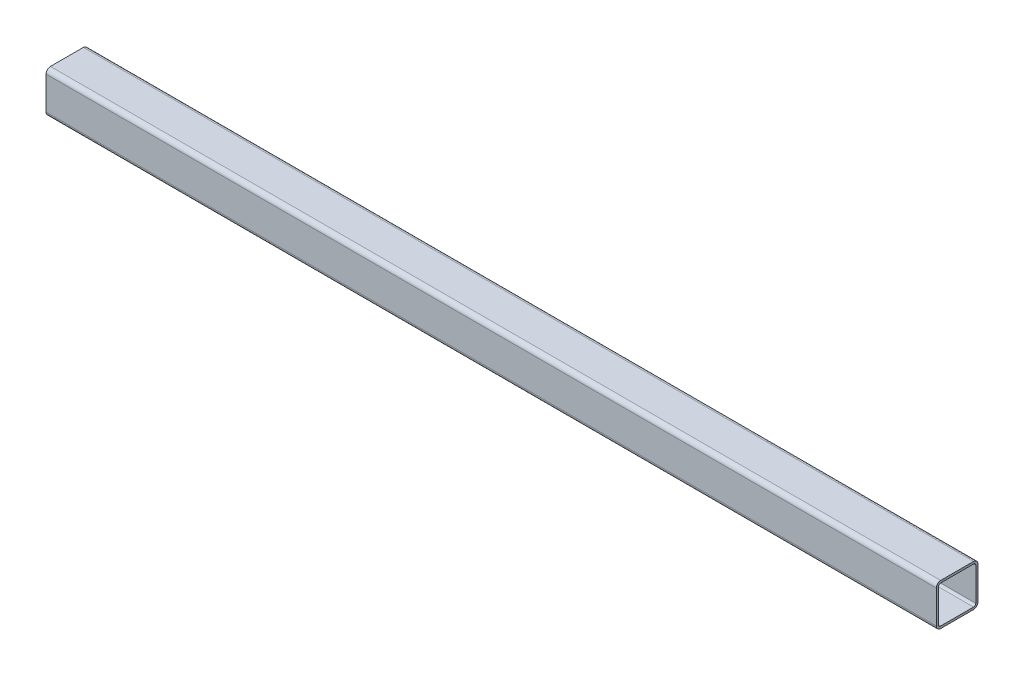
ISO-10303-21;
HEADER;
FILE_DESCRIPTION(('STEP AP214'),'2;1');
FILE_NAME('part.step','',(''),(''),'','','');
FILE_SCHEMA(('AUTOMOTIVE_DESIGN { 1 0 10303 214 1 1 1 1 }'));
ENDSEC;
DATA;
#1=APPLICATION_CONTEXT('core data for automotive mechanical design processes');
#2=APPLICATION_PROTOCOL_DEFINITION('international standard','automotive_design',2000,#1);
#3=PRODUCT_CONTEXT('',#1,'mechanical');
#4=PRODUCT('Part','Part','',(#3));
#5=PRODUCT_RELATED_PRODUCT_CATEGORY('part','',(#4));
#6=PRODUCT_DEFINITION_FORMATION('','',#4);
#7=PRODUCT_DEFINITION_CONTEXT('part definition',#1,'design');
#8=PRODUCT_DEFINITION('design','',#6,#7);
#9=PRODUCT_DEFINITION_SHAPE('','',#8);
#10=(LENGTH_UNIT() NAMED_UNIT(*) SI_UNIT(.MILLI.,.METRE.));
#11=(NAMED_UNIT(*) PLANE_ANGLE_UNIT() SI_UNIT($,.RADIAN.));
#12=(NAMED_UNIT(*) SI_UNIT($,.STERADIAN.) SOLID_ANGLE_UNIT());
#13=UNCERTAINTY_MEASURE_WITH_UNIT(LENGTH_MEASURE(1.E-05),#10,'distance_accuracy_value','');
#14=(GEOMETRIC_REPRESENTATION_CONTEXT(3) GLOBAL_UNCERTAINTY_ASSIGNED_CONTEXT((#13)) GLOBAL_UNIT_ASSIGNED_CONTEXT((#10,
#11,#12)) REPRESENTATION_CONTEXT('',''));
#15=CARTESIAN_POINT('',(0.,0.,0.));
#16=DIRECTION('',(0.,0.,1.));
#17=DIRECTION('',(1.,0.,0.));
#18=AXIS2_PLACEMENT_3D('',#15,#16,#17);
#19=CARTESIAN_POINT('',(530.,260.,1160.));
#20=DIRECTION('',(0.,-1.,0.));
#21=DIRECTION('',(0.,0.,-1.));
#22=AXIS2_PLACEMENT_3D('',#19,#20,#21);
#23=CYLINDRICAL_SURFACE('',#22,2.49999999999995);
#24=CARTESIAN_POINT('',(530.,270.,1160.));
#25=DIRECTION('',(0.,-1.,0.));
#26=DIRECTION('',(0.,0.,-1.));
#27=AXIS2_PLACEMENT_3D('',#24,#25,#26);
#28=CIRCLE('',#27,2.49999999999995);
#29=CARTESIAN_POINT('',(530.,270.,1157.5));
#30=VERTEX_POINT('',#29);
#31=EDGE_CURVE('E172',#30,#30,#28,.T.);
#32=ORIENTED_EDGE('',*,*,#31,.T.);
#33=EDGE_LOOP('',(#32));
#34=FACE_BOUND('',#33,.T.);
#35=CARTESIAN_POINT('',(530.,273.2,1160.));
#36=DIRECTION('',(0.,-1.,0.));
#37=DIRECTION('',(0.,0.,-1.));
#38=AXIS2_PLACEMENT_3D('',#35,#36,#37);
#39=CIRCLE('',#38,2.49999999999995);
#40=CARTESIAN_POINT('',(530.,273.2,1157.5));
#41=VERTEX_POINT('',#40);
#42=EDGE_CURVE('E20',#41,#41,#39,.T.);
#43=ORIENTED_EDGE('',*,*,#42,.F.);
#44=EDGE_LOOP('',(#43));
#45=FACE_BOUND('',#44,.T.);
#46=ADVANCED_FACE('F17',(#34,#45),#23,.F.);
#47=CARTESIAN_POINT('',(490.,260.,1160.));
#48=DIRECTION('',(0.,-1.,0.));
#49=DIRECTION('',(0.,0.,-1.));
#50=AXIS2_PLACEMENT_3D('',#47,#48,#49);
#51=CYLINDRICAL_SURFACE('',#50,2.49999999999995);
#52=CARTESIAN_POINT('',(490.,270.,1160.));
#53=DIRECTION('',(0.,-1.,0.));
#54=DIRECTION('',(0.,0.,-1.));
#55=AXIS2_PLACEMENT_3D('',#52,#53,#54);
#56=CIRCLE('',#55,2.49999999999995);
#57=CARTESIAN_POINT('',(490.,270.,1157.5));
#58=VERTEX_POINT('',#57);
#59=EDGE_CURVE('E243',#58,#58,#56,.T.);
#60=ORIENTED_EDGE('',*,*,#59,.T.);
#61=EDGE_LOOP('',(#60));
#62=FACE_BOUND('',#61,.T.);
#63=CARTESIAN_POINT('',(490.,273.2,1160.));
#64=DIRECTION('',(0.,-1.,0.));
#65=DIRECTION('',(0.,0.,-1.));
#66=AXIS2_PLACEMENT_3D('',#63,#64,#65);
#67=CIRCLE('',#66,2.49999999999995);
#68=CARTESIAN_POINT('',(490.,273.2,1157.5));
#69=VERTEX_POINT('',#68);
#70=EDGE_CURVE('E264',#69,#69,#67,.T.);
#71=ORIENTED_EDGE('',*,*,#70,.F.);
#72=EDGE_LOOP('',(#71));
#73=FACE_BOUND('',#72,.T.);
#74=ADVANCED_FACE('F273',(#62,#73),#51,.F.);
#75=CARTESIAN_POINT('',(490.,260.,1180.));
#76=DIRECTION('',(0.,-1.,0.));
#77=DIRECTION('',(0.,0.,-1.));
#78=AXIS2_PLACEMENT_3D('',#75,#76,#77);
#79=CYLINDRICAL_SURFACE('',#78,2.49999999999995);
#80=CARTESIAN_POINT('',(490.,270.,1180.));
#81=DIRECTION('',(0.,-1.,0.));
#82=DIRECTION('',(0.,0.,-1.));
#83=AXIS2_PLACEMENT_3D('',#80,#81,#82);
#84=CIRCLE('',#83,2.49999999999995);
#85=CARTESIAN_POINT('',(490.,270.,1177.5));
#86=VERTEX_POINT('',#85);
#87=EDGE_CURVE('E240',#86,#86,#84,.T.);
#88=ORIENTED_EDGE('',*,*,#87,.T.);
#89=EDGE_LOOP('',(#88));
#90=FACE_BOUND('',#89,.T.);
#91=CARTESIAN_POINT('',(490.,273.2,1180.));
#92=DIRECTION('',(0.,-1.,0.));
#93=DIRECTION('',(0.,0.,-1.));
#94=AXIS2_PLACEMENT_3D('',#91,#92,#93);
#95=CIRCLE('',#94,2.49999999999995);
#96=CARTESIAN_POINT('',(490.,273.2,1177.5));
#97=VERTEX_POINT('',#96);
#98=EDGE_CURVE('E262',#97,#97,#95,.T.);
#99=ORIENTED_EDGE('',*,*,#98,.F.);
#100=EDGE_LOOP('',(#99));
#101=FACE_BOUND('',#100,.T.);
#102=ADVANCED_FACE('F279',(#90,#101),#79,.F.);
#103=CARTESIAN_POINT('',(530.,260.,1180.));
#104=DIRECTION('',(0.,-1.,0.));
#105=DIRECTION('',(0.,0.,-1.));
#106=AXIS2_PLACEMENT_3D('',#103,#104,#105);
#107=CYLINDRICAL_SURFACE('',#106,2.49999999999995);
#108=CARTESIAN_POINT('',(530.,270.,1180.));
#109=DIRECTION('',(0.,-1.,0.));
#110=DIRECTION('',(0.,0.,-1.));
#111=AXIS2_PLACEMENT_3D('',#108,#109,#110);
#112=CIRCLE('',#111,2.49999999999995);
#113=CARTESIAN_POINT('',(530.,270.,1177.5));
#114=VERTEX_POINT('',#113);
#115=EDGE_CURVE('E237',#114,#114,#112,.T.);
#116=ORIENTED_EDGE('',*,*,#115,.T.);
#117=EDGE_LOOP('',(#116));
#118=FACE_BOUND('',#117,.T.);
#119=CARTESIAN_POINT('',(530.,273.2,1180.));
#120=DIRECTION('',(0.,-1.,0.));
#121=DIRECTION('',(0.,0.,-1.));
#122=AXIS2_PLACEMENT_3D('',#119,#120,#121);
#123=CIRCLE('',#122,2.49999999999995);
#124=CARTESIAN_POINT('',(530.,273.2,1177.5));
#125=VERTEX_POINT('',#124);
#126=EDGE_CURVE('E259',#125,#125,#123,.T.);
#127=ORIENTED_EDGE('',*,*,#126,.F.);
#128=EDGE_LOOP('',(#127));
#129=FACE_BOUND('',#128,.T.);
#130=ADVANCED_FACE('F365',(#118,#129),#107,.F.);
#131=CARTESIAN_POINT('',(-530.,260.,1180.));
#132=DIRECTION('',(0.,-1.,0.));
#133=DIRECTION('',(0.,0.,-1.));
#134=AXIS2_PLACEMENT_3D('',#131,#132,#133);
#135=CYLINDRICAL_SURFACE('',#134,2.49999999999995);
#136=CARTESIAN_POINT('',(-530.,270.,1180.));
#137=DIRECTION('',(0.,-1.,0.));
#138=DIRECTION('',(0.,0.,-1.));
#139=AXIS2_PLACEMENT_3D('',#136,#137,#138);
#140=CIRCLE('',#139,2.49999999999995);
#141=CARTESIAN_POINT('',(-530.,270.,1177.5));
#142=VERTEX_POINT('',#141);
#143=EDGE_CURVE('E234',#142,#142,#140,.T.);
#144=ORIENTED_EDGE('',*,*,#143,.T.);
#145=EDGE_LOOP('',(#144));
#146=FACE_BOUND('',#145,.T.);
#147=CARTESIAN_POINT('',(-530.,273.2,1180.));
#148=DIRECTION('',(0.,-1.,0.));
#149=DIRECTION('',(0.,0.,-1.));
#150=AXIS2_PLACEMENT_3D('',#147,#148,#149);
#151=CIRCLE('',#150,2.49999999999995);
#152=CARTESIAN_POINT('',(-530.,273.2,1177.5));
#153=VERTEX_POINT('',#152);
#154=EDGE_CURVE('E256',#153,#153,#151,.T.);
#155=ORIENTED_EDGE('',*,*,#154,.F.);
#156=EDGE_LOOP('',(#155));
#157=FACE_BOUND('',#156,.T.);
#158=ADVANCED_FACE('F361',(#146,#157),#135,.F.);
#159=CARTESIAN_POINT('',(-490.,260.,1180.));
#160=DIRECTION('',(0.,-1.,0.));
#161=DIRECTION('',(0.,0.,-1.));
#162=AXIS2_PLACEMENT_3D('',#159,#160,#161);
#163=CYLINDRICAL_SURFACE('',#162,2.49999999999995);
#164=CARTESIAN_POINT('',(-490.,270.,1180.));
#165=DIRECTION('',(0.,-1.,0.));
#166=DIRECTION('',(0.,0.,-1.));
#167=AXIS2_PLACEMENT_3D('',#164,#165,#166);
#168=CIRCLE('',#167,2.49999999999995);
#169=CARTESIAN_POINT('',(-490.,270.,1177.5));
#170=VERTEX_POINT('',#169);
#171=EDGE_CURVE('E231',#170,#170,#168,.T.);
#172=ORIENTED_EDGE('',*,*,#171,.T.);
#173=EDGE_LOOP('',(#172));
#174=FACE_BOUND('',#173,.T.);
#175=CARTESIAN_POINT('',(-490.,273.2,1180.));
#176=DIRECTION('',(0.,-1.,0.));
#177=DIRECTION('',(0.,0.,-1.));
#178=AXIS2_PLACEMENT_3D('',#175,#176,#177);
#179=CIRCLE('',#178,2.49999999999995);
#180=CARTESIAN_POINT('',(-490.,273.2,1177.5));
#181=VERTEX_POINT('',#180);
#182=EDGE_CURVE('E253',#181,#181,#179,.T.);
#183=ORIENTED_EDGE('',*,*,#182,.F.);
#184=EDGE_LOOP('',(#183));
#185=FACE_BOUND('',#184,.T.);
#186=ADVANCED_FACE('F357',(#174,#185),#163,.F.);
#187=CARTESIAN_POINT('',(-490.,260.,1160.));
#188=DIRECTION('',(0.,-1.,0.));
#189=DIRECTION('',(0.,0.,-1.));
#190=AXIS2_PLACEMENT_3D('',#187,#188,#189);
#191=CYLINDRICAL_SURFACE('',#190,2.49999999999995);
#192=CARTESIAN_POINT('',(-490.,270.,1160.));
#193=DIRECTION('',(0.,-1.,0.));
#194=DIRECTION('',(0.,0.,-1.));
#195=AXIS2_PLACEMENT_3D('',#192,#193,#194);
#196=CIRCLE('',#195,2.49999999999995);
#197=CARTESIAN_POINT('',(-490.,270.,1157.5));
#198=VERTEX_POINT('',#197);
#199=EDGE_CURVE('E228',#198,#198,#196,.T.);
#200=ORIENTED_EDGE('',*,*,#199,.T.);
#201=EDGE_LOOP('',(#200));
#202=FACE_BOUND('',#201,.T.);
#203=CARTESIAN_POINT('',(-490.,273.2,1160.));
#204=DIRECTION('',(0.,-1.,0.));
#205=DIRECTION('',(0.,0.,-1.));
#206=AXIS2_PLACEMENT_3D('',#203,#204,#205);
#207=CIRCLE('',#206,2.49999999999995);
#208=CARTESIAN_POINT('',(-490.,273.2,1157.5));
#209=VERTEX_POINT('',#208);
#210=EDGE_CURVE('E250',#209,#209,#207,.T.);
#211=ORIENTED_EDGE('',*,*,#210,.F.);
#212=EDGE_LOOP('',(#211));
#213=FACE_BOUND('',#212,.T.);
#214=ADVANCED_FACE('F353',(#202,#213),#191,.F.);
#215=CARTESIAN_POINT('',(-530.,260.,1160.));
#216=DIRECTION('',(0.,-1.,0.));
#217=DIRECTION('',(0.,0.,-1.));
#218=AXIS2_PLACEMENT_3D('',#215,#216,#217);
#219=CYLINDRICAL_SURFACE('',#218,2.49999999999995);
#220=CARTESIAN_POINT('',(-530.,270.,1160.));
#221=DIRECTION('',(0.,-1.,0.));
#222=DIRECTION('',(0.,0.,-1.));
#223=AXIS2_PLACEMENT_3D('',#220,#221,#222);
#224=CIRCLE('',#223,2.49999999999995);
#225=CARTESIAN_POINT('',(-530.,270.,1157.5));
#226=VERTEX_POINT('',#225);
#227=EDGE_CURVE('E159',#226,#226,#224,.T.);
#228=ORIENTED_EDGE('',*,*,#227,.T.);
#229=EDGE_LOOP('',(#228));
#230=FACE_BOUND('',#229,.T.);
#231=CARTESIAN_POINT('',(-530.,273.2,1160.));
#232=DIRECTION('',(0.,-1.,0.));
#233=DIRECTION('',(0.,0.,-1.));
#234=AXIS2_PLACEMENT_3D('',#231,#232,#233);
#235=CIRCLE('',#234,2.49999999999995);
#236=CARTESIAN_POINT('',(-530.,273.2,1157.5));
#237=VERTEX_POINT('',#236);
#238=EDGE_CURVE('E175',#237,#237,#235,.T.);
#239=ORIENTED_EDGE('',*,*,#238,.F.);
#240=EDGE_LOOP('',(#239));
#241=FACE_BOUND('',#240,.T.);
#242=ADVANCED_FACE('F349',(#230,#241),#219,.F.);
#243=CARTESIAN_POINT('',(670.,326.8,1146.4));
#244=DIRECTION('',(0.,-1.,0.));
#245=DIRECTION('',(0.,0.,-1.));
#246=AXIS2_PLACEMENT_3D('',#243,#244,#245);
#247=PLANE('',#246);
#248=DIRECTION('',(-1.,0.,0.));
#249=VECTOR('',#248,1.);
#250=CARTESIAN_POINT('',(670.,326.8,1193.6));
#251=LINE('',#250,#249);
#252=CARTESIAN_POINT('',(640.,326.8,1193.6));
#253=VERTEX_POINT('',#252);
#254=CARTESIAN_POINT('',(-640.,326.8,1193.6));
#255=VERTEX_POINT('',#254);
#256=EDGE_CURVE('E169',#253,#255,#251,.T.);
#257=ORIENTED_EDGE('',*,*,#256,.T.);
#258=DIRECTION('',(0.,0.,1.));
#259=VECTOR('',#258,1.);
#260=CARTESIAN_POINT('',(-640.,326.8,1170.));
#261=LINE('',#260,#259);
#262=CARTESIAN_POINT('',(-640.,326.8,1146.4));
#263=VERTEX_POINT('',#262);
#264=EDGE_CURVE('E222',#263,#255,#261,.T.);
#265=ORIENTED_EDGE('',*,*,#264,.F.);
#266=DIRECTION('',(-1.,0.,0.));
#267=VECTOR('',#266,1.);
#268=CARTESIAN_POINT('',(670.,326.8,1146.4));
#269=LINE('',#268,#267);
#270=CARTESIAN_POINT('',(640.,326.8,1146.4));
#271=VERTEX_POINT('',#270);
#272=EDGE_CURVE('E181',#263,#271,#269,.F.);
#273=ORIENTED_EDGE('',*,*,#272,.T.);
#274=DIRECTION('',(0.,0.,-1.));
#275=VECTOR('',#274,1.);
#276=CARTESIAN_POINT('',(640.,326.8,1170.));
#277=LINE('',#276,#275);
#278=EDGE_CURVE('E208',#253,#271,#277,.T.);
#279=ORIENTED_EDGE('',*,*,#278,.F.);
#280=EDGE_LOOP('',(#257,#265,#273,#279));
#281=FACE_BOUND('',#280,.T.);
#282=ADVANCED_FACE('F345',(#281),#247,.T.);
#283=CARTESIAN_POINT('',(670.,323.6,1146.4));
#284=DIRECTION('',(-1.,0.,0.));
#285=DIRECTION('',(0.,-1.,0.));
#286=AXIS2_PLACEMENT_3D('',#283,#284,#285);
#287=CYLINDRICAL_SURFACE('',#286,3.19999999999998);
#288=CARTESIAN_POINT('',(640.,323.6,1146.4));
#289=DIRECTION('',(-1.,0.,0.));
#290=DIRECTION('',(0.,-1.,0.));
#291=AXIS2_PLACEMENT_3D('',#288,#289,#290);
#292=CIRCLE('',#291,3.19999999999998);
#293=CARTESIAN_POINT('',(640.,323.6,1143.2));
#294=VERTEX_POINT('',#293);
#295=EDGE_CURVE('E206',#271,#294,#292,.T.);
#296=ORIENTED_EDGE('',*,*,#295,.F.);
#297=ORIENTED_EDGE('',*,*,#272,.F.);
#298=CARTESIAN_POINT('',(-640.,323.6,1146.4));
#299=DIRECTION('',(-1.,0.,0.));
#300=DIRECTION('',(0.,-1.,0.));
#301=AXIS2_PLACEMENT_3D('',#298,#299,#300);
#302=CIRCLE('',#301,3.19999999999998);
#303=CARTESIAN_POINT('',(-640.,323.6,1143.2));
#304=VERTEX_POINT('',#303);
#305=EDGE_CURVE('E223',#304,#263,#302,.F.);
#306=ORIENTED_EDGE('',*,*,#305,.F.);
#307=DIRECTION('',(1.,0.,0.));
#308=VECTOR('',#307,1.);
#309=CARTESIAN_POINT('',(670.,323.6,1143.2));
#310=LINE('',#309,#308);
#311=EDGE_CURVE('E179',#294,#304,#310,.F.);
#312=ORIENTED_EDGE('',*,*,#311,.F.);
#313=EDGE_LOOP('',(#296,#297,#306,#312));
#314=FACE_BOUND('',#313,.T.);
#315=ADVANCED_FACE('F341',(#314),#287,.F.);
#316=CARTESIAN_POINT('',(670.,323.6,1143.2));
#317=DIRECTION('',(0.,0.,1.));
#318=DIRECTION('',(0.,-1.,0.));
#319=AXIS2_PLACEMENT_3D('',#316,#317,#318);
#320=PLANE('',#319);
#321=ORIENTED_EDGE('',*,*,#311,.T.);
#322=DIRECTION('',(0.,1.,0.));
#323=VECTOR('',#322,1.);
#324=CARTESIAN_POINT('',(-640.,323.6,1143.2));
#325=LINE('',#324,#323);
#326=CARTESIAN_POINT('',(-640.,276.4,1143.2));
#327=VERTEX_POINT('',#326);
#328=EDGE_CURVE('E142',#327,#304,#325,.T.);
#329=ORIENTED_EDGE('',*,*,#328,.F.);
#330=DIRECTION('',(-1.,0.,0.));
#331=VECTOR('',#330,1.);
#332=CARTESIAN_POINT('',(670.,276.4,1143.2));
#333=LINE('',#332,#331);
#334=CARTESIAN_POINT('',(640.,276.4,1143.2));
#335=VERTEX_POINT('',#334);
#336=EDGE_CURVE('E176',#327,#335,#333,.F.);
#337=ORIENTED_EDGE('',*,*,#336,.T.);
#338=DIRECTION('',(0.,1.,0.));
#339=VECTOR('',#338,1.);
#340=CARTESIAN_POINT('',(640.,276.4,1143.2));
#341=LINE('',#340,#339);
#342=EDGE_CURVE('E205',#294,#335,#341,.F.);
#343=ORIENTED_EDGE('',*,*,#342,.F.);
#344=EDGE_LOOP('',(#321,#329,#337,#343));
#345=FACE_BOUND('',#344,.T.);
#346=ADVANCED_FACE('F337',(#345),#320,.T.);
#347=CARTESIAN_POINT('',(670.,276.4,1146.4));
#348=DIRECTION('',(-1.,0.,0.));
#349=DIRECTION('',(0.,-1.,0.));
#350=AXIS2_PLACEMENT_3D('',#347,#348,#349);
#351=CYLINDRICAL_SURFACE('',#350,3.19999999999998);
#352=CARTESIAN_POINT('',(640.,276.4,1146.4));
#353=DIRECTION('',(-1.,0.,0.));
#354=DIRECTION('',(0.,-1.,0.));
#355=AXIS2_PLACEMENT_3D('',#352,#353,#354);
#356=CIRCLE('',#355,3.19999999999998);
#357=CARTESIAN_POINT('',(640.,273.2,1146.4));
#358=VERTEX_POINT('',#357);
#359=EDGE_CURVE('E203',#335,#358,#356,.T.);
#360=ORIENTED_EDGE('',*,*,#359,.F.);
#361=ORIENTED_EDGE('',*,*,#336,.F.);
#362=CARTESIAN_POINT('',(-640.,276.4,1146.4));
#363=DIRECTION('',(-1.,0.,0.));
#364=DIRECTION('',(0.,-1.,0.));
#365=AXIS2_PLACEMENT_3D('',#362,#363,#364);
#366=CIRCLE('',#365,3.19999999999998);
#367=CARTESIAN_POINT('',(-640.,273.2,1146.4));
#368=VERTEX_POINT('',#367);
#369=EDGE_CURVE('E140',#368,#327,#366,.F.);
#370=ORIENTED_EDGE('',*,*,#369,.F.);
#371=DIRECTION('',(1.,0.,0.));
#372=VECTOR('',#371,1.);
#373=CARTESIAN_POINT('',(670.,273.2,1146.4));
#374=LINE('',#373,#372);
#375=EDGE_CURVE('E126',#358,#368,#374,.F.);
#376=ORIENTED_EDGE('',*,*,#375,.F.);
#377=EDGE_LOOP('',(#360,#361,#370,#376));
#378=FACE_BOUND('',#377,.T.);
#379=ADVANCED_FACE('F334',(#378),#351,.F.);
#380=CARTESIAN_POINT('',(670.,273.2,1193.6));
#381=DIRECTION('',(0.,1.,0.));
#382=DIRECTION('',(0.,0.,1.));
#383=AXIS2_PLACEMENT_3D('',#380,#381,#382);
#384=PLANE('',#383);
#385=ORIENTED_EDGE('',*,*,#375,.T.);
#386=DIRECTION('',(0.,0.,1.));
#387=VECTOR('',#386,1.);
#388=CARTESIAN_POINT('',(-640.,273.2,1170.));
#389=LINE('',#388,#387);
#390=CARTESIAN_POINT('',(-640.,273.2,1193.6));
#391=VERTEX_POINT('',#390);
#392=EDGE_CURVE('E132',#391,#368,#389,.F.);
#393=ORIENTED_EDGE('',*,*,#392,.F.);
#394=DIRECTION('',(-1.,0.,0.));
#395=VECTOR('',#394,1.);
#396=CARTESIAN_POINT('',(670.,273.2,1193.6));
#397=LINE('',#396,#395);
#398=CARTESIAN_POINT('',(640.,273.2,1193.6));
#399=VERTEX_POINT('',#398);
#400=EDGE_CURVE('E118',#391,#399,#397,.F.);
#401=ORIENTED_EDGE('',*,*,#400,.T.);
#402=DIRECTION('',(0.,0.,-1.));
#403=VECTOR('',#402,1.);
#404=CARTESIAN_POINT('',(640.,273.2,1170.));
#405=LINE('',#404,#403);
#406=EDGE_CURVE('E202',#358,#399,#405,.F.);
#407=ORIENTED_EDGE('',*,*,#406,.F.);
#408=EDGE_LOOP('',(#385,#393,#401,#407));
#409=FACE_BOUND('',#408,.T.);
#410=ORIENTED_EDGE('',*,*,#238,.T.);
#411=EDGE_LOOP('',(#410));
#412=FACE_BOUND('',#411,.T.);
#413=ORIENTED_EDGE('',*,*,#210,.T.);
#414=EDGE_LOOP('',(#413));
#415=FACE_BOUND('',#414,.T.);
#416=ORIENTED_EDGE('',*,*,#182,.T.);
#417=EDGE_LOOP('',(#416));
#418=FACE_BOUND('',#417,.T.);
#419=ORIENTED_EDGE('',*,*,#154,.T.);
#420=EDGE_LOOP('',(#419));
#421=FACE_BOUND('',#420,.T.);
#422=ORIENTED_EDGE('',*,*,#126,.T.);
#423=EDGE_LOOP('',(#422));
#424=FACE_BOUND('',#423,.T.);
#425=ORIENTED_EDGE('',*,*,#98,.T.);
#426=EDGE_LOOP('',(#425));
#427=FACE_BOUND('',#426,.T.);
#428=ORIENTED_EDGE('',*,*,#70,.T.);
#429=EDGE_LOOP('',(#428));
#430=FACE_BOUND('',#429,.T.);
#431=ORIENTED_EDGE('',*,*,#42,.T.);
#432=EDGE_LOOP('',(#431));
#433=FACE_BOUND('',#432,.T.);
#434=ADVANCED_FACE('F137',(#409,#412,#415,#418,#421,#424,#427,#430,#433),#384,.T.);
#435=CARTESIAN_POINT('',(670.,276.4,1193.6));
#436=DIRECTION('',(-1.,0.,0.));
#437=DIRECTION('',(0.,-1.,0.));
#438=AXIS2_PLACEMENT_3D('',#435,#436,#437);
#439=CYLINDRICAL_SURFACE('',#438,3.19999999999993);
#440=CARTESIAN_POINT('',(640.,276.4,1193.6));
#441=DIRECTION('',(-1.,0.,0.));
#442=DIRECTION('',(0.,-1.,0.));
#443=AXIS2_PLACEMENT_3D('',#440,#441,#442);
#444=CIRCLE('',#443,3.19999999999993);
#445=CARTESIAN_POINT('',(640.,276.4,1196.8));
#446=VERTEX_POINT('',#445);
#447=EDGE_CURVE('E122',#399,#446,#444,.T.);
#448=ORIENTED_EDGE('',*,*,#447,.F.);
#449=ORIENTED_EDGE('',*,*,#400,.F.);
#450=CARTESIAN_POINT('',(-640.,276.4,1193.6));
#451=DIRECTION('',(-1.,0.,0.));
#452=DIRECTION('',(0.,-1.,0.));
#453=AXIS2_PLACEMENT_3D('',#450,#451,#452);
#454=CIRCLE('',#453,3.19999999999993);
#455=CARTESIAN_POINT('',(-640.,276.4,1196.8));
#456=VERTEX_POINT('',#455);
#457=EDGE_CURVE('E121',#456,#391,#454,.F.);
#458=ORIENTED_EDGE('',*,*,#457,.F.);
#459=DIRECTION('',(1.,0.,0.));
#460=VECTOR('',#459,1.);
#461=CARTESIAN_POINT('',(670.,276.4,1196.8));
#462=LINE('',#461,#460);
#463=EDGE_CURVE('E111',#446,#456,#462,.F.);
#464=ORIENTED_EDGE('',*,*,#463,.F.);
#465=EDGE_LOOP('',(#448,#449,#458,#464));
#466=FACE_BOUND('',#465,.T.);
#467=ADVANCED_FACE('F120',(#466),#439,.F.);
#468=CARTESIAN_POINT('',(670.,276.4,1196.8));
#469=DIRECTION('',(0.,0.,-1.));
#470=DIRECTION('',(0.,1.,0.));
#471=AXIS2_PLACEMENT_3D('',#468,#469,#470);
#472=PLANE('',#471);
#473=ORIENTED_EDGE('',*,*,#463,.T.);
#474=DIRECTION('',(0.,1.,0.));
#475=VECTOR('',#474,1.);
#476=CARTESIAN_POINT('',(-640.,323.6,1196.8));
#477=LINE('',#476,#475);
#478=CARTESIAN_POINT('',(-640.,323.6,1196.8));
#479=VERTEX_POINT('',#478);
#480=EDGE_CURVE('E135',#479,#456,#477,.F.);
#481=ORIENTED_EDGE('',*,*,#480,.F.);
#482=DIRECTION('',(-1.,0.,0.));
#483=VECTOR('',#482,1.);
#484=CARTESIAN_POINT('',(670.,323.6,1196.8));
#485=LINE('',#484,#483);
#486=CARTESIAN_POINT('',(640.,323.6,1196.8));
#487=VERTEX_POINT('',#486);
#488=EDGE_CURVE('E166',#479,#487,#485,.F.);
#489=ORIENTED_EDGE('',*,*,#488,.T.);
#490=DIRECTION('',(0.,1.,0.));
#491=VECTOR('',#490,1.);
#492=CARTESIAN_POINT('',(640.,276.4,1196.8));
#493=LINE('',#492,#491);
#494=EDGE_CURVE('E200',#446,#487,#493,.T.);
#495=ORIENTED_EDGE('',*,*,#494,.F.);
#496=EDGE_LOOP('',(#473,#481,#489,#495));
#497=FACE_BOUND('',#496,.T.);
#498=ADVANCED_FACE('F326',(#497),#472,.T.);
#499=CARTESIAN_POINT('',(670.,323.6,1193.6));
#500=DIRECTION('',(-1.,0.,0.));
#501=DIRECTION('',(0.,-1.,0.));
#502=AXIS2_PLACEMENT_3D('',#499,#500,#501);
#503=CYLINDRICAL_SURFACE('',#502,3.19999999999998);
#504=CARTESIAN_POINT('',(640.,323.6,1193.6));
#505=DIRECTION('',(-1.,0.,0.));
#506=DIRECTION('',(0.,-1.,0.));
#507=AXIS2_PLACEMENT_3D('',#504,#505,#506);
#508=CIRCLE('',#507,3.19999999999998);
#509=EDGE_CURVE('E197',#487,#253,#508,.T.);
#510=ORIENTED_EDGE('',*,*,#509,.F.);
#511=ORIENTED_EDGE('',*,*,#488,.F.);
#512=CARTESIAN_POINT('',(-640.,323.6,1193.6));
#513=DIRECTION('',(-1.,0.,0.));
#514=DIRECTION('',(0.,-1.,0.));
#515=AXIS2_PLACEMENT_3D('',#512,#513,#514);
#516=CIRCLE('',#515,3.19999999999998);
#517=EDGE_CURVE('E220',#255,#479,#516,.F.);
#518=ORIENTED_EDGE('',*,*,#517,.F.);
#519=ORIENTED_EDGE('',*,*,#256,.F.);
#520=EDGE_LOOP('',(#510,#511,#518,#519));
#521=FACE_BOUND('',#520,.T.);
#522=ADVANCED_FACE('F322',(#521),#503,.F.);
#523=CARTESIAN_POINT('',(670.,270.,1193.6));
#524=DIRECTION('',(0.,1.,0.));
#525=DIRECTION('',(0.,0.,1.));
#526=AXIS2_PLACEMENT_3D('',#523,#524,#525);
#527=PLANE('',#526);
#528=DIRECTION('',(-1.,0.,0.));
#529=VECTOR('',#528,1.);
#530=CARTESIAN_POINT('',(670.,270.,1193.6));
#531=LINE('',#530,#529);
#532=CARTESIAN_POINT('',(-640.,270.,1193.6));
#533=VERTEX_POINT('',#532);
#534=CARTESIAN_POINT('',(640.,270.,1193.6));
#535=VERTEX_POINT('',#534);
#536=EDGE_CURVE('E148',#533,#535,#531,.F.);
#537=ORIENTED_EDGE('',*,*,#536,.F.);
#538=DIRECTION('',(0.,0.,1.));
#539=VECTOR('',#538,1.);
#540=CARTESIAN_POINT('',(-640.,270.,1170.));
#541=LINE('',#540,#539);
#542=CARTESIAN_POINT('',(-640.,270.,1146.4));
#543=VERTEX_POINT('',#542);
#544=EDGE_CURVE('E211',#543,#533,#541,.T.);
#545=ORIENTED_EDGE('',*,*,#544,.F.);
#546=DIRECTION('',(-1.,0.,0.));
#547=VECTOR('',#546,1.);
#548=CARTESIAN_POINT('',(670.,270.,1146.4));
#549=LINE('',#548,#547);
#550=CARTESIAN_POINT('',(640.,270.,1146.4));
#551=VERTEX_POINT('',#550);
#552=EDGE_CURVE('E157',#551,#543,#549,.T.);
#553=ORIENTED_EDGE('',*,*,#552,.F.);
#554=DIRECTION('',(0.,0.,-1.));
#555=VECTOR('',#554,1.);
#556=CARTESIAN_POINT('',(640.,270.,1170.));
#557=LINE('',#556,#555);
#558=EDGE_CURVE('E192',#535,#551,#557,.T.);
#559=ORIENTED_EDGE('',*,*,#558,.F.);
#560=EDGE_LOOP('',(#537,#545,#553,#559));
#561=FACE_BOUND('',#560,.T.);
#562=ORIENTED_EDGE('',*,*,#227,.F.);
#563=EDGE_LOOP('',(#562));
#564=FACE_BOUND('',#563,.T.);
#565=ORIENTED_EDGE('',*,*,#199,.F.);
#566=EDGE_LOOP('',(#565));
#567=FACE_BOUND('',#566,.T.);
#568=ORIENTED_EDGE('',*,*,#171,.F.);
#569=EDGE_LOOP('',(#568));
#570=FACE_BOUND('',#569,.T.);
#571=ORIENTED_EDGE('',*,*,#143,.F.);
#572=EDGE_LOOP('',(#571));
#573=FACE_BOUND('',#572,.T.);
#574=ORIENTED_EDGE('',*,*,#115,.F.);
#575=EDGE_LOOP('',(#574));
#576=FACE_BOUND('',#575,.T.);
#577=ORIENTED_EDGE('',*,*,#87,.F.);
#578=EDGE_LOOP('',(#577));
#579=FACE_BOUND('',#578,.T.);
#580=ORIENTED_EDGE('',*,*,#59,.F.);
#581=EDGE_LOOP('',(#580));
#582=FACE_BOUND('',#581,.T.);
#583=ORIENTED_EDGE('',*,*,#31,.F.);
#584=EDGE_LOOP('',(#583));
#585=FACE_BOUND('',#584,.T.);
#586=ADVANCED_FACE('F318',(#561,#564,#567,#570,#573,#576,#579,#582,#585),#527,.F.);
#587=CARTESIAN_POINT('',(670.,276.4,1146.4));
#588=DIRECTION('',(-1.,0.,0.));
#589=DIRECTION('',(0.,-1.,0.));
#590=AXIS2_PLACEMENT_3D('',#587,#588,#589);
#591=CYLINDRICAL_SURFACE('',#590,6.40000000000002);
#592=CARTESIAN_POINT('',(-640.,276.4,1146.4));
#593=DIRECTION('',(-1.,0.,0.));
#594=DIRECTION('',(0.,-1.,0.));
#595=AXIS2_PLACEMENT_3D('',#592,#593,#594);
#596=CIRCLE('',#595,6.40000000000002);
#597=CARTESIAN_POINT('',(-640.,276.4,1140.));
#598=VERTEX_POINT('',#597);
#599=EDGE_CURVE('E212',#598,#543,#596,.T.);
#600=ORIENTED_EDGE('',*,*,#599,.F.);
#601=DIRECTION('',(1.,0.,0.));
#602=VECTOR('',#601,1.);
#603=CARTESIAN_POINT('',(670.,276.4,1140.));
#604=LINE('',#603,#602);
#605=CARTESIAN_POINT('',(640.,276.4,1140.));
#606=VERTEX_POINT('',#605);
#607=EDGE_CURVE('E154',#598,#606,#604,.T.);
#608=ORIENTED_EDGE('',*,*,#607,.T.);
#609=CARTESIAN_POINT('',(640.,276.4,1146.4));
#610=DIRECTION('',(-1.,0.,0.));
#611=DIRECTION('',(0.,-1.,0.));
#612=AXIS2_PLACEMENT_3D('',#609,#610,#611);
#613=CIRCLE('',#612,6.40000000000002);
#614=EDGE_CURVE('E189',#551,#606,#613,.F.);
#615=ORIENTED_EDGE('',*,*,#614,.F.);
#616=ORIENTED_EDGE('',*,*,#552,.T.);
#617=EDGE_LOOP('',(#600,#608,#615,#616));
#618=FACE_BOUND('',#617,.T.);
#619=ADVANCED_FACE('F314',(#618),#591,.T.);
#620=CARTESIAN_POINT('',(670.,323.6,1140.));
#621=DIRECTION('',(0.,0.,1.));
#622=DIRECTION('',(0.,-1.,0.));
#623=AXIS2_PLACEMENT_3D('',#620,#621,#622);
#624=PLANE('',#623);
#625=ORIENTED_EDGE('',*,*,#607,.F.);
#626=DIRECTION('',(0.,1.,0.));
#627=VECTOR('',#626,1.);
#628=CARTESIAN_POINT('',(-640.,323.6,1140.));
#629=LINE('',#628,#627);
#630=CARTESIAN_POINT('',(-640.,323.6,1140.));
#631=VERTEX_POINT('',#630);
#632=EDGE_CURVE('E215',#631,#598,#629,.F.);
#633=ORIENTED_EDGE('',*,*,#632,.F.);
#634=DIRECTION('',(-1.,0.,0.));
#635=VECTOR('',#634,1.);
#636=CARTESIAN_POINT('',(670.,323.6,1140.));
#637=LINE('',#636,#635);
#638=CARTESIAN_POINT('',(640.,323.6,1140.));
#639=VERTEX_POINT('',#638);
#640=EDGE_CURVE('E152',#639,#631,#637,.T.);
#641=ORIENTED_EDGE('',*,*,#640,.F.);
#642=DIRECTION('',(0.,1.,0.));
#643=VECTOR('',#642,1.);
#644=CARTESIAN_POINT('',(640.,276.4,1140.));
#645=LINE('',#644,#643);
#646=EDGE_CURVE('E188',#606,#639,#645,.T.);
#647=ORIENTED_EDGE('',*,*,#646,.F.);
#648=EDGE_LOOP('',(#625,#633,#641,#647));
#649=FACE_BOUND('',#648,.T.);
#650=ADVANCED_FACE('F310',(#649),#624,.F.);
#651=CARTESIAN_POINT('',(670.,323.6,1146.4));
#652=DIRECTION('',(-1.,0.,0.));
#653=DIRECTION('',(0.,-1.,0.));
#654=AXIS2_PLACEMENT_3D('',#651,#652,#653);
#655=CYLINDRICAL_SURFACE('',#654,6.40000000000002);
#656=CARTESIAN_POINT('',(-640.,323.6,1146.4));
#657=DIRECTION('',(-1.,0.,0.));
#658=DIRECTION('',(0.,-1.,0.));
#659=AXIS2_PLACEMENT_3D('',#656,#657,#658);
#660=CIRCLE('',#659,6.40000000000002);
#661=CARTESIAN_POINT('',(-640.,330.,1146.4));
#662=VERTEX_POINT('',#661);
#663=EDGE_CURVE('E216',#662,#631,#660,.T.);
#664=ORIENTED_EDGE('',*,*,#663,.F.);
#665=DIRECTION('',(1.,0.,0.));
#666=VECTOR('',#665,1.);
#667=CARTESIAN_POINT('',(670.,330.,1146.4));
#668=LINE('',#667,#666);
#669=CARTESIAN_POINT('',(640.,330.,1146.4));
#670=VERTEX_POINT('',#669);
#671=EDGE_CURVE('E149',#662,#670,#668,.T.);
#672=ORIENTED_EDGE('',*,*,#671,.T.);
#673=CARTESIAN_POINT('',(640.,323.6,1146.4));
#674=DIRECTION('',(-1.,0.,0.));
#675=DIRECTION('',(0.,-1.,0.));
#676=AXIS2_PLACEMENT_3D('',#673,#674,#675);
#677=CIRCLE('',#676,6.40000000000002);
#678=EDGE_CURVE('E184',#639,#670,#677,.F.);
#679=ORIENTED_EDGE('',*,*,#678,.F.);
#680=ORIENTED_EDGE('',*,*,#640,.T.);
#681=EDGE_LOOP('',(#664,#672,#679,#680));
#682=FACE_BOUND('',#681,.T.);
#683=ADVANCED_FACE('F306',(#682),#655,.T.);
#684=CARTESIAN_POINT('',(670.,330.,1146.4));
#685=DIRECTION('',(0.,-1.,0.));
#686=DIRECTION('',(0.,0.,-1.));
#687=AXIS2_PLACEMENT_3D('',#684,#685,#686);
#688=PLANE('',#687);
#689=ORIENTED_EDGE('',*,*,#671,.F.);
#690=DIRECTION('',(0.,0.,1.));
#691=VECTOR('',#690,1.);
#692=CARTESIAN_POINT('',(-640.,330.,1170.));
#693=LINE('',#692,#691);
#694=CARTESIAN_POINT('',(-640.,330.,1193.6));
#695=VERTEX_POINT('',#694);
#696=EDGE_CURVE('E219',#695,#662,#693,.F.);
#697=ORIENTED_EDGE('',*,*,#696,.F.);
#698=DIRECTION('',(-1.,0.,0.));
#699=VECTOR('',#698,1.);
#700=CARTESIAN_POINT('',(670.,330.,1193.6));
#701=LINE('',#700,#699);
#702=CARTESIAN_POINT('',(640.,330.,1193.6));
#703=VERTEX_POINT('',#702);
#704=EDGE_CURVE('E162',#703,#695,#701,.T.);
#705=ORIENTED_EDGE('',*,*,#704,.F.);
#706=DIRECTION('',(0.,0.,-1.));
#707=VECTOR('',#706,1.);
#708=CARTESIAN_POINT('',(640.,330.,1170.));
#709=LINE('',#708,#707);
#710=EDGE_CURVE('E187',#670,#703,#709,.F.);
#711=ORIENTED_EDGE('',*,*,#710,.F.);
#712=EDGE_LOOP('',(#689,#697,#705,#711));
#713=FACE_BOUND('',#712,.T.);
#714=ADVANCED_FACE('F302',(#713),#688,.F.);
#715=CARTESIAN_POINT('',(670.,276.4,1193.6));
#716=DIRECTION('',(-1.,0.,0.));
#717=DIRECTION('',(0.,-1.,0.));
#718=AXIS2_PLACEMENT_3D('',#715,#716,#717);
#719=CYLINDRICAL_SURFACE('',#718,6.40000000000002);
#720=CARTESIAN_POINT('',(-640.,276.4,1193.6));
#721=DIRECTION('',(-1.,0.,0.));
#722=DIRECTION('',(0.,-1.,0.));
#723=AXIS2_PLACEMENT_3D('',#720,#721,#722);
#724=CIRCLE('',#723,6.40000000000002);
#725=CARTESIAN_POINT('',(-640.,276.4,1200.));
#726=VERTEX_POINT('',#725);
#727=EDGE_CURVE('E165',#533,#726,#724,.T.);
#728=ORIENTED_EDGE('',*,*,#727,.F.);
#729=ORIENTED_EDGE('',*,*,#536,.T.);
#730=CARTESIAN_POINT('',(640.,276.4,1193.6));
#731=DIRECTION('',(-1.,0.,0.));
#732=DIRECTION('',(0.,-1.,0.));
#733=AXIS2_PLACEMENT_3D('',#730,#731,#732);
#734=CIRCLE('',#733,6.40000000000002);
#735=CARTESIAN_POINT('',(640.,276.4,1200.));
#736=VERTEX_POINT('',#735);
#737=EDGE_CURVE('E193',#736,#535,#734,.F.);
#738=ORIENTED_EDGE('',*,*,#737,.F.);
#739=DIRECTION('',(1.,0.,0.));
#740=VECTOR('',#739,1.);
#741=CARTESIAN_POINT('',(670.,276.4,1200.));
#742=LINE('',#741,#740);
#743=EDGE_CURVE('E580',#736,#726,#742,.F.);
#744=ORIENTED_EDGE('',*,*,#743,.T.);
#745=EDGE_LOOP('',(#728,#729,#738,#744));
#746=FACE_BOUND('',#745,.T.);
#747=ADVANCED_FACE('F298',(#746),#719,.T.);
#748=CARTESIAN_POINT('',(-640.,323.6,1170.));
#749=DIRECTION('',(-1.,0.,0.));
#750=DIRECTION('',(0.,0.,1.));
#751=AXIS2_PLACEMENT_3D('',#748,#749,#750);
#752=PLANE('',#751);
#753=ORIENTED_EDGE('',*,*,#727,.T.);
#754=DIRECTION('',(0.,1.,0.));
#755=VECTOR('',#754,1.);
#756=CARTESIAN_POINT('',(-640.,276.4,1200.));
#757=LINE('',#756,#755);
#758=CARTESIAN_POINT('',(-640.,323.6,1200.));
#759=VERTEX_POINT('',#758);
#760=EDGE_CURVE('E578',#726,#759,#757,.T.);
#761=ORIENTED_EDGE('',*,*,#760,.T.);
#762=CARTESIAN_POINT('',(-640.,323.6,1193.6));
#763=DIRECTION('',(-1.,0.,0.));
#764=DIRECTION('',(0.,-1.,0.));
#765=AXIS2_PLACEMENT_3D('',#762,#763,#764);
#766=CIRCLE('',#765,6.40000000000002);
#767=EDGE_CURVE('E164',#695,#759,#766,.F.);
#768=ORIENTED_EDGE('',*,*,#767,.F.);
#769=ORIENTED_EDGE('',*,*,#696,.T.);
#770=ORIENTED_EDGE('',*,*,#663,.T.);
#771=ORIENTED_EDGE('',*,*,#632,.T.);
#772=ORIENTED_EDGE('',*,*,#599,.T.);
#773=ORIENTED_EDGE('',*,*,#544,.T.);
#774=EDGE_LOOP('',(#753,#761,#768,#769,#770,#771,#772,#773));
#775=FACE_BOUND('',#774,.T.);
#776=ORIENTED_EDGE('',*,*,#264,.T.);
#777=ORIENTED_EDGE('',*,*,#517,.T.);
#778=ORIENTED_EDGE('',*,*,#480,.T.);
#779=ORIENTED_EDGE('',*,*,#457,.T.);
#780=ORIENTED_EDGE('',*,*,#392,.T.);
#781=ORIENTED_EDGE('',*,*,#369,.T.);
#782=ORIENTED_EDGE('',*,*,#328,.T.);
#783=ORIENTED_EDGE('',*,*,#305,.T.);
#784=EDGE_LOOP('',(#776,#777,#778,#779,#780,#781,#782,#783));
#785=FACE_BOUND('',#784,.T.);
#786=ADVANCED_FACE('F130',(#775,#785),#752,.T.);
#787=CARTESIAN_POINT('',(670.,323.6,1193.6));
#788=DIRECTION('',(-1.,0.,0.));
#789=DIRECTION('',(0.,-1.,0.));
#790=AXIS2_PLACEMENT_3D('',#787,#788,#789);
#791=CYLINDRICAL_SURFACE('',#790,6.40000000000002);
#792=ORIENTED_EDGE('',*,*,#767,.T.);
#793=DIRECTION('',(1.,0.,0.));
#794=VECTOR('',#793,1.);
#795=CARTESIAN_POINT('',(670.,323.6,1200.));
#796=LINE('',#795,#794);
#797=CARTESIAN_POINT('',(640.,323.6,1200.));
#798=VERTEX_POINT('',#797);
#799=EDGE_CURVE('E26',#759,#798,#796,.T.);
#800=ORIENTED_EDGE('',*,*,#799,.T.);
#801=CARTESIAN_POINT('',(640.,323.6,1193.6));
#802=DIRECTION('',(-1.,0.,0.));
#803=DIRECTION('',(0.,-1.,0.));
#804=AXIS2_PLACEMENT_3D('',#801,#802,#803);
#805=CIRCLE('',#804,6.40000000000002);
#806=EDGE_CURVE('E34',#703,#798,#805,.F.);
#807=ORIENTED_EDGE('',*,*,#806,.F.);
#808=ORIENTED_EDGE('',*,*,#704,.T.);
#809=EDGE_LOOP('',(#792,#800,#807,#808));
#810=FACE_BOUND('',#809,.T.);
#811=ADVANCED_FACE('F289',(#810),#791,.T.);
#812=CARTESIAN_POINT('',(640.,276.4,1170.));
#813=DIRECTION('',(1.,0.,0.));
#814=DIRECTION('',(0.,0.,-1.));
#815=AXIS2_PLACEMENT_3D('',#812,#813,#814);
#816=PLANE('',#815);
#817=ORIENTED_EDGE('',*,*,#678,.T.);
#818=ORIENTED_EDGE('',*,*,#710,.T.);
#819=ORIENTED_EDGE('',*,*,#806,.T.);
#820=DIRECTION('',(0.,1.,0.));
#821=VECTOR('',#820,1.);
#822=CARTESIAN_POINT('',(640.,276.4,1200.));
#823=LINE('',#822,#821);
#824=EDGE_CURVE('E11',#798,#736,#823,.F.);
#825=ORIENTED_EDGE('',*,*,#824,.T.);
#826=ORIENTED_EDGE('',*,*,#737,.T.);
#827=ORIENTED_EDGE('',*,*,#558,.T.);
#828=ORIENTED_EDGE('',*,*,#614,.T.);
#829=ORIENTED_EDGE('',*,*,#646,.T.);
#830=EDGE_LOOP('',(#817,#818,#819,#825,#826,#827,#828,#829));
#831=FACE_BOUND('',#830,.T.);
#832=ORIENTED_EDGE('',*,*,#494,.T.);
#833=ORIENTED_EDGE('',*,*,#509,.T.);
#834=ORIENTED_EDGE('',*,*,#278,.T.);
#835=ORIENTED_EDGE('',*,*,#295,.T.);
#836=ORIENTED_EDGE('',*,*,#342,.T.);
#837=ORIENTED_EDGE('',*,*,#359,.T.);
#838=ORIENTED_EDGE('',*,*,#406,.T.);
#839=ORIENTED_EDGE('',*,*,#447,.T.);
#840=EDGE_LOOP('',(#832,#833,#834,#835,#836,#837,#838,#839));
#841=FACE_BOUND('',#840,.T.);
#842=ADVANCED_FACE('F283',(#831,#841),#816,.T.);
#843=CARTESIAN_POINT('',(670.,276.4,1200.));
#844=DIRECTION('',(0.,0.,-1.));
#845=DIRECTION('',(0.,1.,0.));
#846=AXIS2_PLACEMENT_3D('',#843,#844,#845);
#847=PLANE('',#846);
#848=ORIENTED_EDGE('',*,*,#799,.F.);
#849=ORIENTED_EDGE('',*,*,#760,.F.);
#850=ORIENTED_EDGE('',*,*,#743,.F.);
#851=ORIENTED_EDGE('',*,*,#824,.F.);
#852=EDGE_LOOP('',(#848,#849,#850,#851));
#853=FACE_BOUND('',#852,.T.);
#854=ADVANCED_FACE('F281',(#853),#847,.F.);
#855=CLOSED_SHELL('',(#46,#74,#102,#130,#158,#186,#214,#242,#282,#315,#346,#379,#434,#467,#498,
#522,#586,#619,#650,#683,#714,#747,#786,#811,#842,#854));
#856=MANIFOLD_SOLID_BREP('B1',#855);
#857=ADVANCED_BREP_SHAPE_REPRESENTATION('',(#18,#856),#14);
#858=SHAPE_DEFINITION_REPRESENTATION(#9,#857);
ENDSEC;
END-ISO-10303-21;
